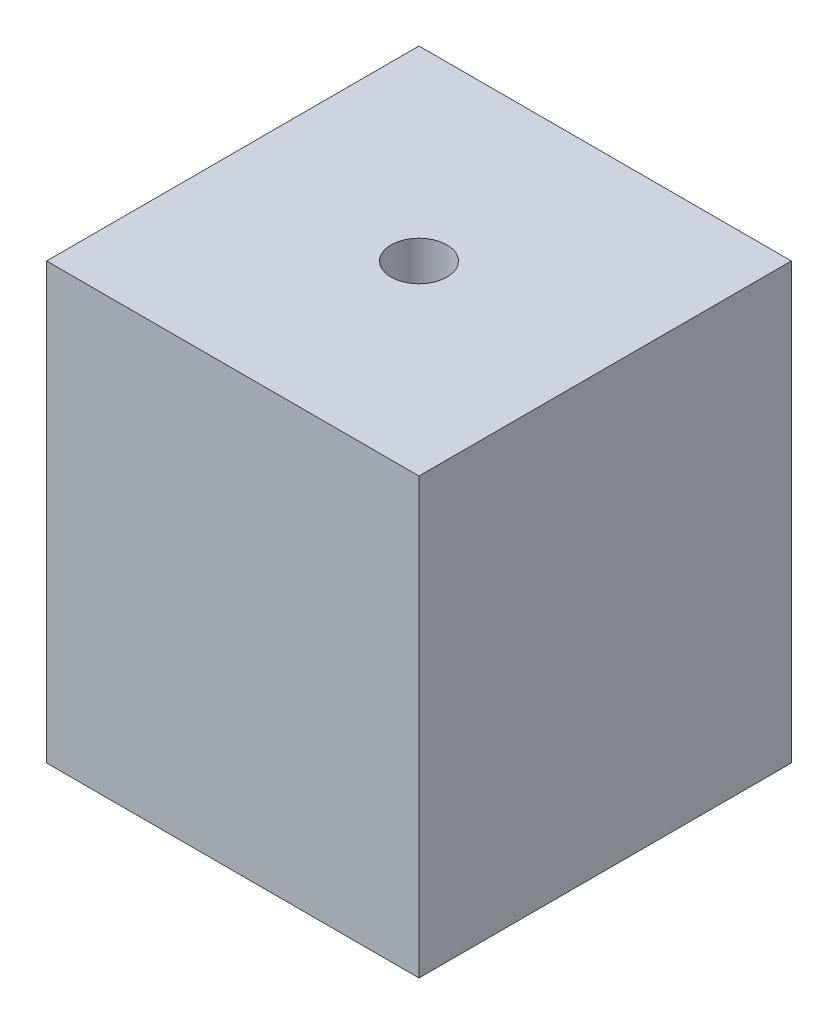
ISO-10303-21;
HEADER;
FILE_DESCRIPTION(('STEP AP214'),'2;1');
FILE_NAME('part.step','',(''),(''),'','','');
FILE_SCHEMA(('AUTOMOTIVE_DESIGN { 1 0 10303 214 1 1 1 1 }'));
ENDSEC;
DATA;
#1=APPLICATION_CONTEXT('core data for automotive mechanical design processes');
#2=APPLICATION_PROTOCOL_DEFINITION('international standard','automotive_design',2000,#1);
#3=PRODUCT_CONTEXT('',#1,'mechanical');
#4=PRODUCT('Part','Part','',(#3));
#5=PRODUCT_RELATED_PRODUCT_CATEGORY('part','',(#4));
#6=PRODUCT_DEFINITION_FORMATION('','',#4);
#7=PRODUCT_DEFINITION_CONTEXT('part definition',#1,'design');
#8=PRODUCT_DEFINITION('design','',#6,#7);
#9=PRODUCT_DEFINITION_SHAPE('','',#8);
#10=(LENGTH_UNIT() NAMED_UNIT(*) SI_UNIT(.MILLI.,.METRE.));
#11=(NAMED_UNIT(*) PLANE_ANGLE_UNIT() SI_UNIT($,.RADIAN.));
#12=(NAMED_UNIT(*) SI_UNIT($,.STERADIAN.) SOLID_ANGLE_UNIT());
#13=UNCERTAINTY_MEASURE_WITH_UNIT(LENGTH_MEASURE(1.E-05),#10,'distance_accuracy_value','');
#14=(GEOMETRIC_REPRESENTATION_CONTEXT(3) GLOBAL_UNCERTAINTY_ASSIGNED_CONTEXT((#13)) GLOBAL_UNIT_ASSIGNED_CONTEXT((#10,
#11,#12)) REPRESENTATION_CONTEXT('',''));
#15=CARTESIAN_POINT('',(0.,0.,0.));
#16=DIRECTION('',(0.,0.,1.));
#17=DIRECTION('',(1.,0.,0.));
#18=AXIS2_PLACEMENT_3D('',#15,#16,#17);
#19=CARTESIAN_POINT('',(10.,23.35,-10.));
#20=DIRECTION('',(-1.,0.,0.));
#21=DIRECTION('',(0.,0.,1.));
#22=AXIS2_PLACEMENT_3D('',#19,#20,#21);
#23=PLANE('',#22);
#24=DIRECTION('',(0.,0.,-1.));
#25=VECTOR('',#24,1.);
#26=CARTESIAN_POINT('',(10.,0.,-10.));
#27=LINE('',#26,#25);
#28=CARTESIAN_POINT('',(10.,0.,10.));
#29=VERTEX_POINT('',#28);
#30=CARTESIAN_POINT('',(10.,0.,-10.));
#31=VERTEX_POINT('',#30);
#32=EDGE_CURVE('E117',#29,#31,#27,.T.);
#33=ORIENTED_EDGE('',*,*,#32,.T.);
#34=DIRECTION('',(0.,-1.,0.));
#35=VECTOR('',#34,1.);
#36=CARTESIAN_POINT('',(10.,23.35,-10.));
#37=LINE('',#36,#35);
#38=CARTESIAN_POINT('',(10.,23.35,-10.));
#39=VERTEX_POINT('',#38);
#40=EDGE_CURVE('E11',#39,#31,#37,.T.);
#41=ORIENTED_EDGE('',*,*,#40,.F.);
#42=DIRECTION('',(0.,0.,-1.));
#43=VECTOR('',#42,1.);
#44=CARTESIAN_POINT('',(10.,23.35,-10.));
#45=LINE('',#44,#43);
#46=CARTESIAN_POINT('',(10.,23.35,10.));
#47=VERTEX_POINT('',#46);
#48=EDGE_CURVE('E101',#47,#39,#45,.T.);
#49=ORIENTED_EDGE('',*,*,#48,.F.);
#50=DIRECTION('',(0.,-1.,0.));
#51=VECTOR('',#50,1.);
#52=CARTESIAN_POINT('',(10.,23.35,10.));
#53=LINE('',#52,#51);
#54=EDGE_CURVE('E111',#47,#29,#53,.T.);
#55=ORIENTED_EDGE('',*,*,#54,.T.);
#56=EDGE_LOOP('',(#33,#41,#49,#55));
#57=FACE_BOUND('',#56,.T.);
#58=ADVANCED_FACE('F44',(#57),#23,.F.);
#59=CARTESIAN_POINT('',(-10.,23.35,-10.));
#60=DIRECTION('',(0.,0.,1.));
#61=DIRECTION('',(1.,0.,0.));
#62=AXIS2_PLACEMENT_3D('',#59,#60,#61);
#63=PLANE('',#62);
#64=DIRECTION('',(-1.,0.,0.));
#65=VECTOR('',#64,1.);
#66=CARTESIAN_POINT('',(-10.,0.,-10.));
#67=LINE('',#66,#65);
#68=CARTESIAN_POINT('',(-10.,0.,-10.));
#69=VERTEX_POINT('',#68);
#70=EDGE_CURVE('E106',#31,#69,#67,.T.);
#71=ORIENTED_EDGE('',*,*,#70,.T.);
#72=DIRECTION('',(0.,-1.,0.));
#73=VECTOR('',#72,1.);
#74=CARTESIAN_POINT('',(-10.,23.35,-10.));
#75=LINE('',#74,#73);
#76=CARTESIAN_POINT('',(-10.,23.35,-10.));
#77=VERTEX_POINT('',#76);
#78=EDGE_CURVE('E60',#77,#69,#75,.T.);
#79=ORIENTED_EDGE('',*,*,#78,.F.);
#80=DIRECTION('',(-1.,0.,0.));
#81=VECTOR('',#80,1.);
#82=CARTESIAN_POINT('',(-10.,23.35,-10.));
#83=LINE('',#82,#81);
#84=EDGE_CURVE('E96',#39,#77,#83,.T.);
#85=ORIENTED_EDGE('',*,*,#84,.F.);
#86=ORIENTED_EDGE('',*,*,#40,.T.);
#87=EDGE_LOOP('',(#71,#79,#85,#86));
#88=FACE_BOUND('',#87,.T.);
#89=ADVANCED_FACE('F104',(#88),#63,.F.);
#90=CARTESIAN_POINT('',(-10.,23.35,-10.));
#91=DIRECTION('',(1.,0.,0.));
#92=DIRECTION('',(0.,0.,-1.));
#93=AXIS2_PLACEMENT_3D('',#90,#91,#92);
#94=PLANE('',#93);
#95=DIRECTION('',(0.,0.,1.));
#96=VECTOR('',#95,1.);
#97=CARTESIAN_POINT('',(-10.,0.,-10.));
#98=LINE('',#97,#96);
#99=CARTESIAN_POINT('',(-10.,0.,10.));
#100=VERTEX_POINT('',#99);
#101=EDGE_CURVE('E83',#69,#100,#98,.T.);
#102=ORIENTED_EDGE('',*,*,#101,.T.);
#103=DIRECTION('',(0.,-1.,0.));
#104=VECTOR('',#103,1.);
#105=CARTESIAN_POINT('',(-10.,23.35,10.));
#106=LINE('',#105,#104);
#107=CARTESIAN_POINT('',(-10.,23.35,10.));
#108=VERTEX_POINT('',#107);
#109=EDGE_CURVE('E107',#108,#100,#106,.T.);
#110=ORIENTED_EDGE('',*,*,#109,.F.);
#111=DIRECTION('',(0.,0.,1.));
#112=VECTOR('',#111,1.);
#113=CARTESIAN_POINT('',(-10.,23.35,-10.));
#114=LINE('',#113,#112);
#115=EDGE_CURVE('E97',#77,#108,#114,.T.);
#116=ORIENTED_EDGE('',*,*,#115,.F.);
#117=ORIENTED_EDGE('',*,*,#78,.T.);
#118=EDGE_LOOP('',(#102,#110,#116,#117));
#119=FACE_BOUND('',#118,.T.);
#120=ADVANCED_FACE('F109',(#119),#94,.F.);
#121=CARTESIAN_POINT('',(-10.,23.35,10.));
#122=DIRECTION('',(0.,0.,-1.));
#123=DIRECTION('',(-1.,0.,0.));
#124=AXIS2_PLACEMENT_3D('',#121,#122,#123);
#125=PLANE('',#124);
#126=DIRECTION('',(1.,0.,0.));
#127=VECTOR('',#126,1.);
#128=CARTESIAN_POINT('',(-10.,0.,10.));
#129=LINE('',#128,#127);
#130=EDGE_CURVE('E90',#100,#29,#129,.T.);
#131=ORIENTED_EDGE('',*,*,#130,.T.);
#132=ORIENTED_EDGE('',*,*,#54,.F.);
#133=DIRECTION('',(1.,0.,0.));
#134=VECTOR('',#133,1.);
#135=CARTESIAN_POINT('',(-10.,23.35,10.));
#136=LINE('',#135,#134);
#137=EDGE_CURVE('E66',#108,#47,#136,.T.);
#138=ORIENTED_EDGE('',*,*,#137,.F.);
#139=ORIENTED_EDGE('',*,*,#109,.T.);
#140=EDGE_LOOP('',(#131,#132,#138,#139));
#141=FACE_BOUND('',#140,.T.);
#142=ADVANCED_FACE('F161',(#141),#125,.F.);
#143=CARTESIAN_POINT('',(0.,23.35,0.));
#144=DIRECTION('',(0.,1.,0.));
#145=DIRECTION('',(0.,0.,1.));
#146=AXIS2_PLACEMENT_3D('',#143,#144,#145);
#147=PLANE('',#146);
#148=CARTESIAN_POINT('',(0.,23.350012,0.));
#149=DIRECTION('',(0.,1.,0.));
#150=DIRECTION('',(0.,0.,1.));
#151=AXIS2_PLACEMENT_3D('',#148,#149,#150);
#152=CIRCLE('',#151,1.5);
#153=CARTESIAN_POINT('',(0.,23.350012,1.5));
#154=VERTEX_POINT('',#153);
#155=EDGE_CURVE('E131',#154,#154,#152,.T.);
#156=ORIENTED_EDGE('',*,*,#155,.F.);
#157=EDGE_LOOP('',(#156));
#158=FACE_BOUND('',#157,.T.);
#159=ORIENTED_EDGE('',*,*,#48,.T.);
#160=ORIENTED_EDGE('',*,*,#84,.T.);
#161=ORIENTED_EDGE('',*,*,#115,.T.);
#162=ORIENTED_EDGE('',*,*,#137,.T.);
#163=EDGE_LOOP('',(#159,#160,#161,#162));
#164=FACE_BOUND('',#163,.T.);
#165=ADVANCED_FACE('F100',(#158,#164),#147,.T.);
#166=CARTESIAN_POINT('',(0.,0.,0.));
#167=DIRECTION('',(0.,1.,0.));
#168=DIRECTION('',(0.,0.,1.));
#169=AXIS2_PLACEMENT_3D('',#166,#167,#168);
#170=PLANE('',#169);
#171=CARTESIAN_POINT('',(0.,0.,0.));
#172=DIRECTION('',(0.,1.,0.));
#173=DIRECTION('',(0.,0.,1.));
#174=AXIS2_PLACEMENT_3D('',#171,#172,#173);
#175=CIRCLE('',#174,1.5);
#176=CARTESIAN_POINT('',(0.,0.,1.5));
#177=VERTEX_POINT('',#176);
#178=EDGE_CURVE('E125',#177,#177,#175,.T.);
#179=ORIENTED_EDGE('',*,*,#178,.T.);
#180=EDGE_LOOP('',(#179));
#181=FACE_BOUND('',#180,.T.);
#182=ORIENTED_EDGE('',*,*,#32,.F.);
#183=ORIENTED_EDGE('',*,*,#130,.F.);
#184=ORIENTED_EDGE('',*,*,#101,.F.);
#185=ORIENTED_EDGE('',*,*,#70,.F.);
#186=EDGE_LOOP('',(#182,#183,#184,#185));
#187=FACE_BOUND('',#186,.T.);
#188=ADVANCED_FACE('F156',(#181,#187),#170,.F.);
#189=CARTESIAN_POINT('',(0.,0.,0.));
#190=DIRECTION('',(0.,1.,0.));
#191=DIRECTION('',(0.,0.,1.));
#192=AXIS2_PLACEMENT_3D('',#189,#190,#191);
#193=CYLINDRICAL_SURFACE('',#192,1.5);
#194=ORIENTED_EDGE('',*,*,#178,.F.);
#195=EDGE_LOOP('',(#194));
#196=FACE_BOUND('',#195,.T.);
#197=ORIENTED_EDGE('',*,*,#155,.T.);
#198=EDGE_LOOP('',(#197));
#199=FACE_BOUND('',#198,.T.);
#200=ADVANCED_FACE('F146',(#196,#199),#193,.F.);
#201=CLOSED_SHELL('',(#58,#89,#120,#142,#165,#188,#200));
#202=MANIFOLD_SOLID_BREP('B2',#201);
#203=ADVANCED_BREP_SHAPE_REPRESENTATION('',(#18,#202),#14);
#204=SHAPE_DEFINITION_REPRESENTATION(#9,#203);
ENDSEC;
END-ISO-10303-21;
